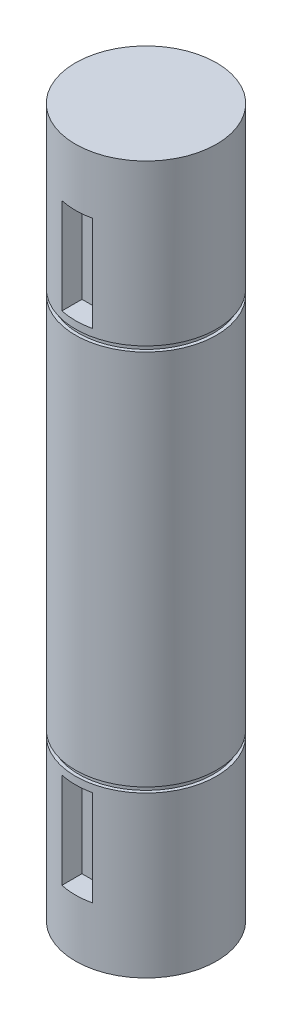
ISO-10303-21;
HEADER;
FILE_DESCRIPTION(('STEP AP214'),'2;1');
FILE_NAME('part.step','',(''),(''),'','','');
FILE_SCHEMA(('AUTOMOTIVE_DESIGN { 1 0 10303 214 1 1 1 1 }'));
ENDSEC;
DATA;
#1=APPLICATION_CONTEXT('core data for automotive mechanical design processes');
#2=APPLICATION_PROTOCOL_DEFINITION('international standard','automotive_design',2000,#1);
#3=PRODUCT_CONTEXT('',#1,'mechanical');
#4=PRODUCT('Part','Part','',(#3));
#5=PRODUCT_RELATED_PRODUCT_CATEGORY('part','',(#4));
#6=PRODUCT_DEFINITION_FORMATION('','',#4);
#7=PRODUCT_DEFINITION_CONTEXT('part definition',#1,'design');
#8=PRODUCT_DEFINITION('design','',#6,#7);
#9=PRODUCT_DEFINITION_SHAPE('','',#8);
#10=(LENGTH_UNIT() NAMED_UNIT(*) SI_UNIT(.MILLI.,.METRE.));
#11=(NAMED_UNIT(*) PLANE_ANGLE_UNIT() SI_UNIT($,.RADIAN.));
#12=(NAMED_UNIT(*) SI_UNIT($,.STERADIAN.) SOLID_ANGLE_UNIT());
#13=UNCERTAINTY_MEASURE_WITH_UNIT(LENGTH_MEASURE(1.E-05),#10,'distance_accuracy_value','');
#14=(GEOMETRIC_REPRESENTATION_CONTEXT(3) GLOBAL_UNCERTAINTY_ASSIGNED_CONTEXT((#13)) GLOBAL_UNIT_ASSIGNED_CONTEXT((#10,
#11,#12)) REPRESENTATION_CONTEXT('',''));
#15=CARTESIAN_POINT('',(0.,0.,0.));
#16=DIRECTION('',(0.,0.,1.));
#17=DIRECTION('',(1.,0.,0.));
#18=AXIS2_PLACEMENT_3D('',#15,#16,#17);
#19=CARTESIAN_POINT('',(0.,326.,0.));
#20=DIRECTION('',(0.,-1.,0.));
#21=DIRECTION('',(0.,0.,-1.));
#22=AXIS2_PLACEMENT_3D('',#19,#20,#21);
#23=CYLINDRICAL_SURFACE('',#22,32.5);
#24=CARTESIAN_POINT('',(0.,249.78,0.));
#25=DIRECTION('',(0.,-1.,0.));
#26=DIRECTION('',(0.,0.,-1.));
#27=AXIS2_PLACEMENT_3D('',#24,#25,#26);
#28=CIRCLE('',#27,32.5);
#29=CARTESIAN_POINT('',(0.,249.78,-32.5));
#30=VERTEX_POINT('',#29);
#31=EDGE_CURVE('E169',#30,#30,#28,.T.);
#32=ORIENTED_EDGE('',*,*,#31,.T.);
#33=EDGE_LOOP('',(#32));
#34=FACE_BOUND('',#33,.T.);
#35=CARTESIAN_POINT('',(0.,76.2200000000001,0.));
#36=DIRECTION('',(0.,1.,0.));
#37=DIRECTION('',(0.,0.,1.));
#38=AXIS2_PLACEMENT_3D('',#35,#36,#37);
#39=CIRCLE('',#38,32.5);
#40=CARTESIAN_POINT('',(0.,76.2200000000001,32.5));
#41=VERTEX_POINT('',#40);
#42=EDGE_CURVE('E177',#41,#41,#39,.T.);
#43=ORIENTED_EDGE('',*,*,#42,.T.);
#44=EDGE_LOOP('',(#43));
#45=FACE_BOUND('',#44,.T.);
#46=ADVANCED_FACE('F36',(#34,#45),#23,.T.);
#47=CARTESIAN_POINT('',(0.,76.2200000000001,0.));
#48=DIRECTION('',(0.,1.,0.));
#49=DIRECTION('',(0.,0.,1.));
#50=AXIS2_PLACEMENT_3D('',#47,#48,#49);
#51=PLANE('',#50);
#52=CARTESIAN_POINT('',(0.,76.2200000000001,0.));
#53=DIRECTION('',(0.,1.,0.));
#54=DIRECTION('',(0.,0.,1.));
#55=AXIS2_PLACEMENT_3D('',#52,#53,#54);
#56=CIRCLE('',#55,31.);
#57=CARTESIAN_POINT('',(0.,76.2200000000001,-31.));
#58=VERTEX_POINT('',#57);
#59=EDGE_CURVE('E162',#58,#58,#56,.T.);
#60=ORIENTED_EDGE('',*,*,#59,.T.);
#61=EDGE_LOOP('',(#60));
#62=FACE_BOUND('',#61,.T.);
#63=ORIENTED_EDGE('',*,*,#42,.F.);
#64=EDGE_LOOP('',(#63));
#65=FACE_BOUND('',#64,.T.);
#66=ADVANCED_FACE('F223',(#62,#65),#51,.F.);
#67=CARTESIAN_POINT('',(0.,73.8000000000001,0.));
#68=DIRECTION('',(0.,1.,0.));
#69=DIRECTION('',(0.,0.,1.));
#70=AXIS2_PLACEMENT_3D('',#67,#68,#69);
#71=PLANE('',#70);
#72=CARTESIAN_POINT('',(0.,73.8000000000001,0.));
#73=DIRECTION('',(0.,1.,0.));
#74=DIRECTION('',(0.,0.,1.));
#75=AXIS2_PLACEMENT_3D('',#72,#73,#74);
#76=CIRCLE('',#75,31.);
#77=CARTESIAN_POINT('',(0.,73.8000000000001,-31.));
#78=VERTEX_POINT('',#77);
#79=EDGE_CURVE('E166',#78,#78,#76,.T.);
#80=ORIENTED_EDGE('',*,*,#79,.F.);
#81=EDGE_LOOP('',(#80));
#82=FACE_BOUND('',#81,.T.);
#83=CARTESIAN_POINT('',(0.,73.8000000000001,0.));
#84=DIRECTION('',(0.,1.,0.));
#85=DIRECTION('',(0.,0.,1.));
#86=AXIS2_PLACEMENT_3D('',#83,#84,#85);
#87=CIRCLE('',#86,32.5);
#88=CARTESIAN_POINT('',(0.,73.8000000000001,32.5));
#89=VERTEX_POINT('',#88);
#90=EDGE_CURVE('E165',#89,#89,#87,.T.);
#91=ORIENTED_EDGE('',*,*,#90,.T.);
#92=EDGE_LOOP('',(#91));
#93=FACE_BOUND('',#92,.T.);
#94=ADVANCED_FACE('F231',(#82,#93),#71,.T.);
#95=CARTESIAN_POINT('',(0.,76.2200000000001,0.));
#96=DIRECTION('',(0.,-1.,0.));
#97=DIRECTION('',(0.,0.,-1.));
#98=AXIS2_PLACEMENT_3D('',#95,#96,#97);
#99=CYLINDRICAL_SURFACE('',#98,31.);
#100=CARTESIAN_POINT('',(0.,76.2200000000001,-31.));
#101=CARTESIAN_POINT('',(0.,76.1947916666668,-31.));
#102=CARTESIAN_POINT('',(0.,76.1695833333334,-31.));
#103=CARTESIAN_POINT('',(0.,76.1191666666668,-31.));
#104=CARTESIAN_POINT('',(0.,76.0939583333334,-31.));
#105=CARTESIAN_POINT('',(0.,76.0435416666668,-31.));
#106=CARTESIAN_POINT('',(0.,76.0183333333334,-31.));
#107=CARTESIAN_POINT('',(0.,75.9679166666668,-31.));
#108=CARTESIAN_POINT('',(0.,75.9427083333334,-31.));
#109=CARTESIAN_POINT('',(0.,75.8922916666668,-31.));
#110=CARTESIAN_POINT('',(0.,75.8670833333334,-31.));
#111=CARTESIAN_POINT('',(0.,75.8166666666667,-31.));
#112=CARTESIAN_POINT('',(0.,75.7914583333334,-31.));
#113=CARTESIAN_POINT('',(0.,75.7410416666668,-31.));
#114=CARTESIAN_POINT('',(0.,75.7158333333334,-31.));
#115=CARTESIAN_POINT('',(0.,75.6654166666667,-31.));
#116=CARTESIAN_POINT('',(0.,75.6402083333334,-31.));
#117=CARTESIAN_POINT('',(0.,75.5897916666668,-31.));
#118=CARTESIAN_POINT('',(0.,75.5645833333334,-31.));
#119=CARTESIAN_POINT('',(0.,75.5141666666668,-31.));
#120=CARTESIAN_POINT('',(0.,75.4889583333334,-31.));
#121=CARTESIAN_POINT('',(0.,75.4385416666668,-31.));
#122=CARTESIAN_POINT('',(0.,75.4133333333334,-31.));
#123=CARTESIAN_POINT('',(0.,75.3629166666667,-31.));
#124=CARTESIAN_POINT('',(0.,75.3377083333334,-31.));
#125=CARTESIAN_POINT('',(0.,75.2872916666668,-31.));
#126=CARTESIAN_POINT('',(0.,75.2620833333334,-31.));
#127=CARTESIAN_POINT('',(0.,75.2116666666667,-31.));
#128=CARTESIAN_POINT('',(0.,75.1864583333334,-31.));
#129=CARTESIAN_POINT('',(0.,75.1360416666668,-31.));
#130=CARTESIAN_POINT('',(0.,75.1108333333334,-31.));
#131=CARTESIAN_POINT('',(0.,75.0604166666668,-31.));
#132=CARTESIAN_POINT('',(0.,75.0352083333334,-31.));
#133=CARTESIAN_POINT('',(0.,74.9847916666668,-31.));
#134=CARTESIAN_POINT('',(0.,74.9595833333334,-31.));
#135=CARTESIAN_POINT('',(0.,74.9091666666667,-31.));
#136=CARTESIAN_POINT('',(0.,74.8839583333334,-31.));
#137=CARTESIAN_POINT('',(0.,74.8335416666667,-31.));
#138=CARTESIAN_POINT('',(0.,74.8083333333334,-31.));
#139=CARTESIAN_POINT('',(0.,74.7579166666668,-31.));
#140=CARTESIAN_POINT('',(0.,74.7327083333334,-31.));
#141=CARTESIAN_POINT('',(0.,74.6822916666667,-31.));
#142=CARTESIAN_POINT('',(0.,74.6570833333334,-31.));
#143=CARTESIAN_POINT('',(0.,74.6066666666668,-31.));
#144=CARTESIAN_POINT('',(0.,74.5814583333334,-31.));
#145=CARTESIAN_POINT('',(0.,74.5310416666668,-31.));
#146=CARTESIAN_POINT('',(0.,74.5058333333334,-31.));
#147=CARTESIAN_POINT('',(0.,74.4554166666667,-31.));
#148=CARTESIAN_POINT('',(0.,74.4302083333334,-31.));
#149=CARTESIAN_POINT('',(0.,74.3797916666667,-31.));
#150=CARTESIAN_POINT('',(0.,74.3545833333334,-31.));
#151=CARTESIAN_POINT('',(0.,74.3041666666668,-31.));
#152=CARTESIAN_POINT('',(0.,74.2789583333334,-31.));
#153=CARTESIAN_POINT('',(0.,74.2285416666667,-31.));
#154=CARTESIAN_POINT('',(0.,74.2033333333334,-31.));
#155=CARTESIAN_POINT('',(0.,74.1529166666668,-31.));
#156=CARTESIAN_POINT('',(0.,74.1277083333334,-31.));
#157=CARTESIAN_POINT('',(0.,74.0772916666668,-31.));
#158=CARTESIAN_POINT('',(0.,74.0520833333334,-31.));
#159=CARTESIAN_POINT('',(0.,74.0016666666668,-31.));
#160=CARTESIAN_POINT('',(0.,73.9764583333334,-31.));
#161=CARTESIAN_POINT('',(0.,73.9260416666667,-31.));
#162=CARTESIAN_POINT('',(0.,73.9008333333334,-31.));
#163=CARTESIAN_POINT('',(0.,73.8504166666667,-31.));
#164=CARTESIAN_POINT('',(0.,73.8252083333334,-31.));
#165=CARTESIAN_POINT('',(0.,73.8000000000001,-31.));
#166=B_SPLINE_CURVE_WITH_KNOTS('',3,(#100,#101,#102,#103,#104,#105,#106,#107,#108,#109,#110,
#111,#112,#113,#114,#115,#116,#117,#118,#119,#120,#121,#122,#123,#124,#125,#126,#127,#128,#129,
#130,#131,#132,#133,#134,#135,#136,#137,#138,#139,#140,#141,#142,#143,#144,#145,#146,#147,#148,
#149,#150,#151,#152,#153,#154,#155,#156,#157,#158,#159,#160,#161,#162,#163,#164,#165),
.UNSPECIFIED.,.F.,.F.,(4,2,2,2,2,2,2,2,2,2,2,2,2,2,2,2,2,2,2,2,2,2,2,2,2,2,2,2,2,2,2,2,4),(0.,
0.0756250000000097,0.151250000000006,0.226875000000001,0.302500000000011,0.378125000000007,
0.453750000000003,0.529375000000012,0.605000000000008,0.680625000000004,0.756250000000014,
0.83187500000001,0.907500000000006,0.983125000000015,1.05875000000001,1.13437500000001,
1.21000000000002,1.28562500000001,1.36125000000001,1.436875,1.51250000000001,1.58812500000001,
1.66375000000001,1.73937500000002,1.81500000000001,1.89062500000001,1.96625000000002,
2.04187500000001,2.11750000000001,2.19312500000002,2.26875000000001,2.34437500000001,
2.42000000000002),.UNSPECIFIED.);
#167=EDGE_CURVE('BSEAM249',#58,#78,#166,.T.);
#168=ORIENTED_EDGE('',*,*,#59,.F.);
#169=ORIENTED_EDGE('',*,*,#79,.T.);
#170=ORIENTED_EDGE('',*,*,#167,.T.);
#171=ORIENTED_EDGE('',*,*,#167,.F.);
#172=EDGE_LOOP('',(#168,#170,#169,#171));
#173=FACE_BOUND('',#172,.T.);
#174=ADVANCED_FACE('F249',(#173),#99,.T.);
#175=CARTESIAN_POINT('',(0.,0.,0.));
#176=DIRECTION('',(0.,1.,0.));
#177=DIRECTION('',(0.,0.,1.));
#178=AXIS2_PLACEMENT_3D('',#175,#176,#177);
#179=PLANE('',#178);
#180=CARTESIAN_POINT('',(0.,0.,0.));
#181=DIRECTION('',(0.,1.,0.));
#182=DIRECTION('',(0.,0.,1.));
#183=AXIS2_PLACEMENT_3D('',#180,#181,#182);
#184=CIRCLE('',#183,32.5);
#185=CARTESIAN_POINT('',(0.,0.,32.5));
#186=VERTEX_POINT('',#185);
#187=EDGE_CURVE('E174',#186,#186,#184,.T.);
#188=ORIENTED_EDGE('',*,*,#187,.F.);
#189=EDGE_LOOP('',(#188));
#190=FACE_BOUND('',#189,.T.);
#191=ADVANCED_FACE('F240',(#190),#179,.F.);
#192=CARTESIAN_POINT('',(0.,70.4000000000002,0.));
#193=DIRECTION('',(0.,1.,0.));
#194=DIRECTION('',(0.,0.,1.));
#195=AXIS2_PLACEMENT_3D('',#192,#193,#194);
#196=CIRCLE('',#195,32.5);
#197=CARTESIAN_POINT('',(-6.99999999999999,70.4000000000002,31.7372021451167));
#198=VERTEX_POINT('',#197);
#199=CARTESIAN_POINT('',(7.00000000000001,70.4000000000002,31.7372021451167));
#200=VERTEX_POINT('',#199);
#201=EDGE_CURVE('E58',#198,#200,#196,.T.);
#202=ORIENTED_EDGE('',*,*,#201,.T.);
#203=DIRECTION('',(0.,-1.,0.));
#204=VECTOR('',#203,1.);
#205=CARTESIAN_POINT('',(7.00000000000004,326.,31.7372021451167));
#206=LINE('',#205,#204);
#207=CARTESIAN_POINT('',(7.,26.4000000000002,31.7372021451167));
#208=VERTEX_POINT('',#207);
#209=EDGE_CURVE('E11',#200,#208,#206,.T.);
#210=ORIENTED_EDGE('',*,*,#209,.T.);
#211=CARTESIAN_POINT('',(0.,26.4000000000002,0.));
#212=DIRECTION('',(0.,-1.,0.));
#213=DIRECTION('',(0.,0.,-1.));
#214=AXIS2_PLACEMENT_3D('',#211,#212,#213);
#215=CIRCLE('',#214,32.5);
#216=CARTESIAN_POINT('',(-7.,26.4000000000002,31.7372021451167));
#217=VERTEX_POINT('',#216);
#218=EDGE_CURVE('E194',#208,#217,#215,.T.);
#219=ORIENTED_EDGE('',*,*,#218,.T.);
#220=DIRECTION('',(0.,-1.,0.));
#221=VECTOR('',#220,1.);
#222=CARTESIAN_POINT('',(-6.99999999999996,326.,31.7372021451167));
#223=LINE('',#222,#221);
#224=EDGE_CURVE('E43',#217,#198,#223,.F.);
#225=ORIENTED_EDGE('',*,*,#224,.T.);
#226=EDGE_LOOP('',(#202,#210,#219,#225));
#227=FACE_BOUND('',#226,.T.);
#228=ORIENTED_EDGE('',*,*,#187,.T.);
#229=EDGE_LOOP('',(#228));
#230=FACE_BOUND('',#229,.T.);
#231=ORIENTED_EDGE('',*,*,#90,.F.);
#232=EDGE_LOOP('',(#231));
#233=FACE_BOUND('',#232,.T.);
#234=ADVANCED_FACE('F199',(#227,#230,#233),#23,.T.);
#235=CARTESIAN_POINT('',(0.,249.78,0.));
#236=DIRECTION('',(0.,-1.,0.));
#237=DIRECTION('',(0.,0.,-1.));
#238=AXIS2_PLACEMENT_3D('',#235,#236,#237);
#239=PLANE('',#238);
#240=CARTESIAN_POINT('',(0.,249.78,0.));
#241=DIRECTION('',(0.,-1.,0.));
#242=DIRECTION('',(0.,0.,-1.));
#243=AXIS2_PLACEMENT_3D('',#240,#241,#242);
#244=CIRCLE('',#243,31.);
#245=CARTESIAN_POINT('',(0.,249.78,31.));
#246=VERTEX_POINT('',#245);
#247=EDGE_CURVE('E156',#246,#246,#244,.T.);
#248=ORIENTED_EDGE('',*,*,#247,.T.);
#249=EDGE_LOOP('',(#248));
#250=FACE_BOUND('',#249,.T.);
#251=ORIENTED_EDGE('',*,*,#31,.F.);
#252=EDGE_LOOP('',(#251));
#253=FACE_BOUND('',#252,.T.);
#254=ADVANCED_FACE('F239',(#250,#253),#239,.F.);
#255=CARTESIAN_POINT('',(0.,252.2,0.));
#256=DIRECTION('',(0.,-1.,0.));
#257=DIRECTION('',(0.,0.,-1.));
#258=AXIS2_PLACEMENT_3D('',#255,#256,#257);
#259=PLANE('',#258);
#260=CARTESIAN_POINT('',(0.,252.2,0.));
#261=DIRECTION('',(0.,-1.,0.));
#262=DIRECTION('',(0.,0.,-1.));
#263=AXIS2_PLACEMENT_3D('',#260,#261,#262);
#264=CIRCLE('',#263,31.);
#265=CARTESIAN_POINT('',(0.,252.2,31.));
#266=VERTEX_POINT('',#265);
#267=EDGE_CURVE('E135',#266,#266,#264,.T.);
#268=ORIENTED_EDGE('',*,*,#267,.F.);
#269=EDGE_LOOP('',(#268));
#270=FACE_BOUND('',#269,.T.);
#271=CARTESIAN_POINT('',(0.,252.2,0.));
#272=DIRECTION('',(0.,-1.,0.));
#273=DIRECTION('',(0.,0.,-1.));
#274=AXIS2_PLACEMENT_3D('',#271,#272,#273);
#275=CIRCLE('',#274,32.5);
#276=CARTESIAN_POINT('',(0.,252.2,-32.5));
#277=VERTEX_POINT('',#276);
#278=EDGE_CURVE('E159',#277,#277,#275,.T.);
#279=ORIENTED_EDGE('',*,*,#278,.T.);
#280=EDGE_LOOP('',(#279));
#281=FACE_BOUND('',#280,.T.);
#282=ADVANCED_FACE('F245',(#270,#281),#259,.T.);
#283=CARTESIAN_POINT('',(0.,249.78,0.));
#284=DIRECTION('',(0.,1.,0.));
#285=DIRECTION('',(0.,0.,1.));
#286=AXIS2_PLACEMENT_3D('',#283,#284,#285);
#287=CYLINDRICAL_SURFACE('',#286,31.);
#288=CARTESIAN_POINT('',(0.,249.78,31.));
#289=CARTESIAN_POINT('',(0.,249.805208333333,31.));
#290=CARTESIAN_POINT('',(0.,249.830416666667,31.));
#291=CARTESIAN_POINT('',(0.,249.880833333333,31.));
#292=CARTESIAN_POINT('',(0.,249.906041666667,31.));
#293=CARTESIAN_POINT('',(0.,249.956458333333,31.));
#294=CARTESIAN_POINT('',(0.,249.981666666667,31.));
#295=CARTESIAN_POINT('',(0.,250.032083333333,31.));
#296=CARTESIAN_POINT('',(0.,250.057291666667,31.));
#297=CARTESIAN_POINT('',(0.,250.107708333333,31.));
#298=CARTESIAN_POINT('',(0.,250.132916666667,31.));
#299=CARTESIAN_POINT('',(0.,250.183333333333,31.));
#300=CARTESIAN_POINT('',(0.,250.208541666667,31.));
#301=CARTESIAN_POINT('',(0.,250.258958333333,31.));
#302=CARTESIAN_POINT('',(0.,250.284166666667,31.));
#303=CARTESIAN_POINT('',(0.,250.334583333333,31.));
#304=CARTESIAN_POINT('',(0.,250.359791666667,31.));
#305=CARTESIAN_POINT('',(0.,250.410208333333,31.));
#306=CARTESIAN_POINT('',(0.,250.435416666667,31.));
#307=CARTESIAN_POINT('',(0.,250.485833333333,31.));
#308=CARTESIAN_POINT('',(0.,250.511041666667,31.));
#309=CARTESIAN_POINT('',(0.,250.561458333333,31.));
#310=CARTESIAN_POINT('',(0.,250.586666666667,31.));
#311=CARTESIAN_POINT('',(0.,250.637083333333,31.));
#312=CARTESIAN_POINT('',(0.,250.662291666667,31.));
#313=CARTESIAN_POINT('',(0.,250.712708333333,31.));
#314=CARTESIAN_POINT('',(0.,250.737916666667,31.));
#315=CARTESIAN_POINT('',(0.,250.788333333333,31.));
#316=CARTESIAN_POINT('',(0.,250.813541666667,31.));
#317=CARTESIAN_POINT('',(0.,250.863958333333,31.));
#318=CARTESIAN_POINT('',(0.,250.889166666667,31.));
#319=CARTESIAN_POINT('',(0.,250.939583333333,31.));
#320=CARTESIAN_POINT('',(0.,250.964791666667,31.));
#321=CARTESIAN_POINT('',(0.,251.015208333333,31.));
#322=CARTESIAN_POINT('',(0.,251.040416666667,31.));
#323=CARTESIAN_POINT('',(0.,251.090833333333,31.));
#324=CARTESIAN_POINT('',(0.,251.116041666667,31.));
#325=CARTESIAN_POINT('',(0.,251.166458333333,31.));
#326=CARTESIAN_POINT('',(0.,251.191666666667,31.));
#327=CARTESIAN_POINT('',(0.,251.242083333333,31.));
#328=CARTESIAN_POINT('',(0.,251.267291666667,31.));
#329=CARTESIAN_POINT('',(0.,251.317708333333,31.));
#330=CARTESIAN_POINT('',(0.,251.342916666667,31.));
#331=CARTESIAN_POINT('',(0.,251.393333333333,31.));
#332=CARTESIAN_POINT('',(0.,251.418541666667,31.));
#333=CARTESIAN_POINT('',(0.,251.468958333333,31.));
#334=CARTESIAN_POINT('',(0.,251.494166666667,31.));
#335=CARTESIAN_POINT('',(0.,251.544583333333,31.));
#336=CARTESIAN_POINT('',(0.,251.569791666667,31.));
#337=CARTESIAN_POINT('',(0.,251.620208333333,31.));
#338=CARTESIAN_POINT('',(0.,251.645416666667,31.));
#339=CARTESIAN_POINT('',(0.,251.695833333333,31.));
#340=CARTESIAN_POINT('',(0.,251.721041666667,31.));
#341=CARTESIAN_POINT('',(0.,251.771458333333,31.));
#342=CARTESIAN_POINT('',(0.,251.796666666667,31.));
#343=CARTESIAN_POINT('',(0.,251.847083333333,31.));
#344=CARTESIAN_POINT('',(0.,251.872291666667,31.));
#345=CARTESIAN_POINT('',(0.,251.922708333333,31.));
#346=CARTESIAN_POINT('',(0.,251.947916666667,31.));
#347=CARTESIAN_POINT('',(0.,251.998333333333,31.));
#348=CARTESIAN_POINT('',(0.,252.023541666667,31.));
#349=CARTESIAN_POINT('',(0.,252.073958333333,31.));
#350=CARTESIAN_POINT('',(0.,252.099166666667,31.));
#351=CARTESIAN_POINT('',(0.,252.149583333333,31.));
#352=CARTESIAN_POINT('',(0.,252.174791666667,31.));
#353=CARTESIAN_POINT('',(0.,252.2,31.));
#354=B_SPLINE_CURVE_WITH_KNOTS('',3,(#288,#289,#290,#291,#292,#293,#294,#295,#296,#297,#298,
#299,#300,#301,#302,#303,#304,#305,#306,#307,#308,#309,#310,#311,#312,#313,#314,#315,#316,#317,
#318,#319,#320,#321,#322,#323,#324,#325,#326,#327,#328,#329,#330,#331,#332,#333,#334,#335,#336,
#337,#338,#339,#340,#341,#342,#343,#344,#345,#346,#347,#348,#349,#350,#351,#352,#353),
.UNSPECIFIED.,.F.,.F.,(4,2,2,2,2,2,2,2,2,2,2,2,2,2,2,2,2,2,2,2,2,2,2,2,2,2,2,2,2,2,2,2,4),(0.,
0.0756250000000236,0.151250000000019,0.226875000000043,0.302500000000011,0.378125000000035,
0.453750000000003,0.529375000000026,0.604999999999994,0.680625000000018,0.756250000000042,
0.83187500000001,0.907500000000033,0.983125000000001,1.05875000000002,1.13437500000005,
1.21000000000002,1.28562500000004,1.36125000000001,1.43687500000003,1.5125,1.58812500000002,
1.66375000000005,1.73937500000002,1.81500000000004,1.89062500000001,1.96625000000003,
2.04187500000005,2.11750000000002,2.19312500000005,2.26875000000001,2.34437500000004,
2.42000000000006),.UNSPECIFIED.);
#355=EDGE_CURVE('BSEAM261',#246,#266,#354,.T.);
#356=ORIENTED_EDGE('',*,*,#247,.F.);
#357=ORIENTED_EDGE('',*,*,#267,.T.);
#358=ORIENTED_EDGE('',*,*,#355,.T.);
#359=ORIENTED_EDGE('',*,*,#355,.F.);
#360=EDGE_LOOP('',(#356,#358,#357,#359));
#361=FACE_BOUND('',#360,.T.);
#362=ADVANCED_FACE('F261',(#361),#287,.T.);
#363=CARTESIAN_POINT('',(0.,326.,0.));
#364=DIRECTION('',(0.,1.,0.));
#365=DIRECTION('',(0.,0.,1.));
#366=AXIS2_PLACEMENT_3D('',#363,#364,#365);
#367=PLANE('',#366);
#368=CARTESIAN_POINT('',(0.,326.,0.));
#369=DIRECTION('',(0.,1.,0.));
#370=DIRECTION('',(0.,0.,1.));
#371=AXIS2_PLACEMENT_3D('',#368,#369,#370);
#372=CIRCLE('',#371,32.5);
#373=CARTESIAN_POINT('',(0.,326.,32.5));
#374=VERTEX_POINT('',#373);
#375=EDGE_CURVE('E170',#374,#374,#372,.T.);
#376=ORIENTED_EDGE('',*,*,#375,.T.);
#377=EDGE_LOOP('',(#376));
#378=FACE_BOUND('',#377,.T.);
#379=ADVANCED_FACE('F236',(#378),#367,.T.);
#380=CARTESIAN_POINT('',(0.,299.6,0.));
#381=DIRECTION('',(0.,1.,0.));
#382=DIRECTION('',(0.,0.,1.));
#383=AXIS2_PLACEMENT_3D('',#380,#381,#382);
#384=CIRCLE('',#383,32.5);
#385=CARTESIAN_POINT('',(-7.,299.6,31.7372021451167));
#386=VERTEX_POINT('',#385);
#387=CARTESIAN_POINT('',(7.,299.6,31.7372021451167));
#388=VERTEX_POINT('',#387);
#389=EDGE_CURVE('E173',#386,#388,#384,.T.);
#390=ORIENTED_EDGE('',*,*,#389,.T.);
#391=DIRECTION('',(0.,-1.,0.));
#392=VECTOR('',#391,1.);
#393=CARTESIAN_POINT('',(7.,326.,31.7372021451167));
#394=LINE('',#393,#392);
#395=CARTESIAN_POINT('',(7.00000000000001,255.6,31.7372021451167));
#396=VERTEX_POINT('',#395);
#397=EDGE_CURVE('E109',#388,#396,#394,.T.);
#398=ORIENTED_EDGE('',*,*,#397,.T.);
#399=CARTESIAN_POINT('',(0.,255.6,0.));
#400=DIRECTION('',(0.,-1.,0.));
#401=DIRECTION('',(0.,0.,-1.));
#402=AXIS2_PLACEMENT_3D('',#399,#400,#401);
#403=CIRCLE('',#402,32.5);
#404=CARTESIAN_POINT('',(-6.99999999999999,255.6,31.7372021451167));
#405=VERTEX_POINT('',#404);
#406=EDGE_CURVE('E190',#396,#405,#403,.T.);
#407=ORIENTED_EDGE('',*,*,#406,.T.);
#408=DIRECTION('',(0.,-1.,0.));
#409=VECTOR('',#408,1.);
#410=CARTESIAN_POINT('',(-7.,326.,31.7372021451167));
#411=LINE('',#410,#409);
#412=EDGE_CURVE('E187',#405,#386,#411,.F.);
#413=ORIENTED_EDGE('',*,*,#412,.T.);
#414=EDGE_LOOP('',(#390,#398,#407,#413));
#415=FACE_BOUND('',#414,.T.);
#416=ORIENTED_EDGE('',*,*,#375,.F.);
#417=EDGE_LOOP('',(#416));
#418=FACE_BOUND('',#417,.T.);
#419=ORIENTED_EDGE('',*,*,#278,.F.);
#420=EDGE_LOOP('',(#419));
#421=FACE_BOUND('',#420,.T.);
#422=ADVANCED_FACE('F225',(#415,#418,#421),#23,.T.);
#423=CARTESIAN_POINT('',(7.,299.6,22.5));
#424=DIRECTION('',(1.,0.,0.));
#425=DIRECTION('',(0.,1.,0.));
#426=AXIS2_PLACEMENT_3D('',#423,#424,#425);
#427=PLANE('',#426);
#428=DIRECTION('',(0.,0.,1.));
#429=VECTOR('',#428,1.);
#430=CARTESIAN_POINT('',(7.,299.6,22.5));
#431=LINE('',#430,#429);
#432=CARTESIAN_POINT('',(7.,299.6,22.5));
#433=VERTEX_POINT('',#432);
#434=EDGE_CURVE('E101',#433,#388,#431,.T.);
#435=ORIENTED_EDGE('',*,*,#434,.F.);
#436=DIRECTION('',(0.,1.,0.));
#437=VECTOR('',#436,1.);
#438=CARTESIAN_POINT('',(7.,299.6,22.5));
#439=LINE('',#438,#437);
#440=CARTESIAN_POINT('',(7.00000000000001,255.6,22.5));
#441=VERTEX_POINT('',#440);
#442=EDGE_CURVE('E106',#441,#433,#439,.T.);
#443=ORIENTED_EDGE('',*,*,#442,.F.);
#444=DIRECTION('',(0.,0.,1.));
#445=VECTOR('',#444,1.);
#446=CARTESIAN_POINT('',(7.00000000000001,255.6,22.5));
#447=LINE('',#446,#445);
#448=EDGE_CURVE('E133',#441,#396,#447,.T.);
#449=ORIENTED_EDGE('',*,*,#448,.T.);
#450=ORIENTED_EDGE('',*,*,#397,.F.);
#451=EDGE_LOOP('',(#435,#443,#449,#450));
#452=FACE_BOUND('',#451,.T.);
#453=ADVANCED_FACE('F103',(#452),#427,.F.);
#454=CARTESIAN_POINT('',(-6.99999999999999,255.6,22.5));
#455=DIRECTION('',(0.,-1.,0.));
#456=DIRECTION('',(0.,0.,-1.));
#457=AXIS2_PLACEMENT_3D('',#454,#455,#456);
#458=PLANE('',#457);
#459=ORIENTED_EDGE('',*,*,#448,.F.);
#460=DIRECTION('',(1.,0.,0.));
#461=VECTOR('',#460,1.);
#462=CARTESIAN_POINT('',(-6.99999999999999,255.6,22.5));
#463=LINE('',#462,#461);
#464=CARTESIAN_POINT('',(-6.99999999999999,255.6,22.5));
#465=VERTEX_POINT('',#464);
#466=EDGE_CURVE('E112',#465,#441,#463,.T.);
#467=ORIENTED_EDGE('',*,*,#466,.F.);
#468=DIRECTION('',(0.,0.,1.));
#469=VECTOR('',#468,1.);
#470=CARTESIAN_POINT('',(-6.99999999999999,255.6,22.5));
#471=LINE('',#470,#469);
#472=EDGE_CURVE('E136',#465,#405,#471,.T.);
#473=ORIENTED_EDGE('',*,*,#472,.T.);
#474=ORIENTED_EDGE('',*,*,#406,.F.);
#475=EDGE_LOOP('',(#459,#467,#473,#474));
#476=FACE_BOUND('',#475,.T.);
#477=ADVANCED_FACE('F283',(#476),#458,.F.);
#478=CARTESIAN_POINT('',(-7.,299.6,22.5));
#479=DIRECTION('',(-1.,0.,0.));
#480=DIRECTION('',(0.,-1.,0.));
#481=AXIS2_PLACEMENT_3D('',#478,#479,#480);
#482=PLANE('',#481);
#483=ORIENTED_EDGE('',*,*,#472,.F.);
#484=DIRECTION('',(0.,-1.,0.));
#485=VECTOR('',#484,1.);
#486=CARTESIAN_POINT('',(-7.,299.6,22.5));
#487=LINE('',#486,#485);
#488=CARTESIAN_POINT('',(-7.,299.6,22.5));
#489=VERTEX_POINT('',#488);
#490=EDGE_CURVE('E121',#489,#465,#487,.T.);
#491=ORIENTED_EDGE('',*,*,#490,.F.);
#492=DIRECTION('',(0.,0.,1.));
#493=VECTOR('',#492,1.);
#494=CARTESIAN_POINT('',(-7.,299.6,22.5));
#495=LINE('',#494,#493);
#496=EDGE_CURVE('E111',#489,#386,#495,.T.);
#497=ORIENTED_EDGE('',*,*,#496,.T.);
#498=ORIENTED_EDGE('',*,*,#412,.F.);
#499=EDGE_LOOP('',(#483,#491,#497,#498));
#500=FACE_BOUND('',#499,.T.);
#501=ADVANCED_FACE('F286',(#500),#482,.F.);
#502=CARTESIAN_POINT('',(-7.,299.6,22.5));
#503=DIRECTION('',(0.,1.,0.));
#504=DIRECTION('',(0.,0.,1.));
#505=AXIS2_PLACEMENT_3D('',#502,#503,#504);
#506=PLANE('',#505);
#507=ORIENTED_EDGE('',*,*,#389,.F.);
#508=ORIENTED_EDGE('',*,*,#496,.F.);
#509=DIRECTION('',(-1.,0.,0.));
#510=VECTOR('',#509,1.);
#511=CARTESIAN_POINT('',(-7.,299.6,22.5));
#512=LINE('',#511,#510);
#513=EDGE_CURVE('E115',#433,#489,#512,.T.);
#514=ORIENTED_EDGE('',*,*,#513,.F.);
#515=ORIENTED_EDGE('',*,*,#434,.T.);
#516=EDGE_LOOP('',(#507,#508,#514,#515));
#517=FACE_BOUND('',#516,.T.);
#518=ADVANCED_FACE('F116',(#517),#506,.F.);
#519=CARTESIAN_POINT('',(0.,0.,22.5));
#520=DIRECTION('',(0.,0.,1.));
#521=DIRECTION('',(1.,0.,0.));
#522=AXIS2_PLACEMENT_3D('',#519,#520,#521);
#523=PLANE('',#522);
#524=ORIENTED_EDGE('',*,*,#442,.T.);
#525=ORIENTED_EDGE('',*,*,#513,.T.);
#526=ORIENTED_EDGE('',*,*,#490,.T.);
#527=ORIENTED_EDGE('',*,*,#466,.T.);
#528=EDGE_LOOP('',(#524,#525,#526,#527));
#529=FACE_BOUND('',#528,.T.);
#530=ADVANCED_FACE('F123',(#529),#523,.T.);
#531=CARTESIAN_POINT('',(-7.,26.4000000000002,22.5));
#532=DIRECTION('',(-1.,0.,0.));
#533=DIRECTION('',(0.,-1.,0.));
#534=AXIS2_PLACEMENT_3D('',#531,#532,#533);
#535=PLANE('',#534);
#536=DIRECTION('',(0.,0.,1.));
#537=VECTOR('',#536,1.);
#538=CARTESIAN_POINT('',(-7.,26.4000000000002,22.5));
#539=LINE('',#538,#537);
#540=CARTESIAN_POINT('',(-7.,26.4000000000002,22.5));
#541=VERTEX_POINT('',#540);
#542=EDGE_CURVE('E50',#541,#217,#539,.T.);
#543=ORIENTED_EDGE('',*,*,#542,.F.);
#544=DIRECTION('',(0.,-1.,0.));
#545=VECTOR('',#544,1.);
#546=CARTESIAN_POINT('',(-7.,26.4000000000002,22.5));
#547=LINE('',#546,#545);
#548=CARTESIAN_POINT('',(-6.99999999999999,70.4000000000002,22.5));
#549=VERTEX_POINT('',#548);
#550=EDGE_CURVE('E125',#549,#541,#547,.T.);
#551=ORIENTED_EDGE('',*,*,#550,.F.);
#552=DIRECTION('',(0.,0.,1.));
#553=VECTOR('',#552,1.);
#554=CARTESIAN_POINT('',(-6.99999999999999,70.4000000000002,22.5));
#555=LINE('',#554,#553);
#556=EDGE_CURVE('E147',#549,#198,#555,.T.);
#557=ORIENTED_EDGE('',*,*,#556,.T.);
#558=ORIENTED_EDGE('',*,*,#224,.F.);
#559=EDGE_LOOP('',(#543,#551,#557,#558));
#560=FACE_BOUND('',#559,.T.);
#561=ADVANCED_FACE('F203',(#560),#535,.F.);
#562=CARTESIAN_POINT('',(-6.99999999999999,70.4000000000002,22.5));
#563=DIRECTION('',(0.,1.,0.));
#564=DIRECTION('',(0.,0.,1.));
#565=AXIS2_PLACEMENT_3D('',#562,#563,#564);
#566=PLANE('',#565);
#567=ORIENTED_EDGE('',*,*,#201,.F.);
#568=ORIENTED_EDGE('',*,*,#556,.F.);
#569=DIRECTION('',(-1.,0.,0.));
#570=VECTOR('',#569,1.);
#571=CARTESIAN_POINT('',(-6.99999999999999,70.4000000000002,22.5));
#572=LINE('',#571,#570);
#573=CARTESIAN_POINT('',(7.00000000000001,70.4000000000002,22.5));
#574=VERTEX_POINT('',#573);
#575=EDGE_CURVE('E141',#574,#549,#572,.T.);
#576=ORIENTED_EDGE('',*,*,#575,.F.);
#577=DIRECTION('',(0.,0.,1.));
#578=VECTOR('',#577,1.);
#579=CARTESIAN_POINT('',(7.00000000000001,70.4000000000002,22.5));
#580=LINE('',#579,#578);
#581=EDGE_CURVE('E145',#574,#200,#580,.T.);
#582=ORIENTED_EDGE('',*,*,#581,.T.);
#583=EDGE_LOOP('',(#567,#568,#576,#582));
#584=FACE_BOUND('',#583,.T.);
#585=ADVANCED_FACE('F206',(#584),#566,.F.);
#586=CARTESIAN_POINT('',(7.,26.4000000000002,22.5));
#587=DIRECTION('',(1.,0.,0.));
#588=DIRECTION('',(0.,1.,0.));
#589=AXIS2_PLACEMENT_3D('',#586,#587,#588);
#590=PLANE('',#589);
#591=ORIENTED_EDGE('',*,*,#581,.F.);
#592=DIRECTION('',(0.,1.,0.));
#593=VECTOR('',#592,1.);
#594=CARTESIAN_POINT('',(7.,26.4000000000002,22.5));
#595=LINE('',#594,#593);
#596=CARTESIAN_POINT('',(7.,26.4000000000002,22.5));
#597=VERTEX_POINT('',#596);
#598=EDGE_CURVE('E151',#597,#574,#595,.T.);
#599=ORIENTED_EDGE('',*,*,#598,.F.);
#600=DIRECTION('',(0.,0.,1.));
#601=VECTOR('',#600,1.);
#602=CARTESIAN_POINT('',(7.,26.4000000000002,22.5));
#603=LINE('',#602,#601);
#604=EDGE_CURVE('E142',#597,#208,#603,.T.);
#605=ORIENTED_EDGE('',*,*,#604,.T.);
#606=ORIENTED_EDGE('',*,*,#209,.F.);
#607=EDGE_LOOP('',(#591,#599,#605,#606));
#608=FACE_BOUND('',#607,.T.);
#609=ADVANCED_FACE('F211',(#608),#590,.F.);
#610=CARTESIAN_POINT('',(-7.,26.4000000000002,22.5));
#611=DIRECTION('',(0.,-1.,0.));
#612=DIRECTION('',(0.,0.,-1.));
#613=AXIS2_PLACEMENT_3D('',#610,#611,#612);
#614=PLANE('',#613);
#615=ORIENTED_EDGE('',*,*,#604,.F.);
#616=DIRECTION('',(1.,0.,0.));
#617=VECTOR('',#616,1.);
#618=CARTESIAN_POINT('',(-7.,26.4000000000002,22.5));
#619=LINE('',#618,#617);
#620=EDGE_CURVE('E128',#541,#597,#619,.T.);
#621=ORIENTED_EDGE('',*,*,#620,.F.);
#622=ORIENTED_EDGE('',*,*,#542,.T.);
#623=ORIENTED_EDGE('',*,*,#218,.F.);
#624=EDGE_LOOP('',(#615,#621,#622,#623));
#625=FACE_BOUND('',#624,.T.);
#626=ADVANCED_FACE('F212',(#625),#614,.F.);
#627=CARTESIAN_POINT('',(0.,0.,22.5));
#628=DIRECTION('',(0.,0.,-1.));
#629=DIRECTION('',(-1.,0.,0.));
#630=AXIS2_PLACEMENT_3D('',#627,#628,#629);
#631=PLANE('',#630);
#632=ORIENTED_EDGE('',*,*,#550,.T.);
#633=ORIENTED_EDGE('',*,*,#620,.T.);
#634=ORIENTED_EDGE('',*,*,#598,.T.);
#635=ORIENTED_EDGE('',*,*,#575,.T.);
#636=EDGE_LOOP('',(#632,#633,#634,#635));
#637=FACE_BOUND('',#636,.T.);
#638=ADVANCED_FACE('F208',(#637),#631,.F.);
#639=CLOSED_SHELL('',(#46,#66,#94,#174,#191,#234,#254,#282,#362,#379,#422,#453,#477,#501,#518,
#530,#561,#585,#609,#626,#638));
#640=MANIFOLD_SOLID_BREP('B2',#639);
#641=ADVANCED_BREP_SHAPE_REPRESENTATION('',(#18,#640),#14);
#642=SHAPE_DEFINITION_REPRESENTATION(#9,#641);
ENDSEC;
END-ISO-10303-21;
